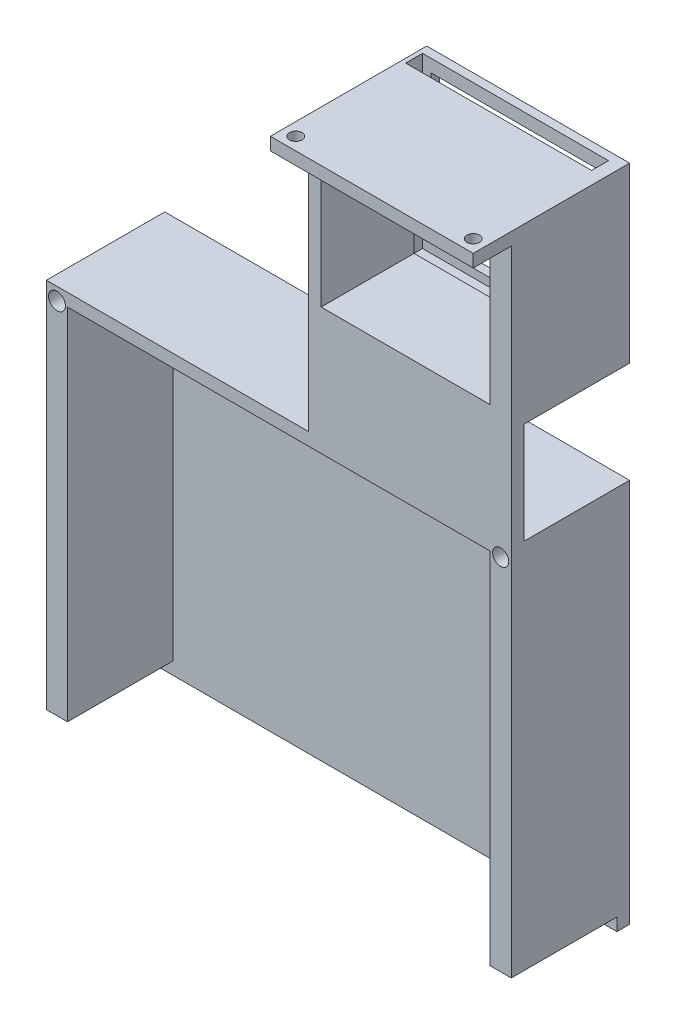
ISO-10303-21;
HEADER;
FILE_DESCRIPTION(('STEP AP214'),'2;1');
FILE_NAME('part.step','',(''),(''),'','','');
FILE_SCHEMA(('AUTOMOTIVE_DESIGN { 1 0 10303 214 1 1 1 1 }'));
ENDSEC;
DATA;
#1=APPLICATION_CONTEXT('core data for automotive mechanical design processes');
#2=APPLICATION_PROTOCOL_DEFINITION('international standard','automotive_design',2000,#1);
#3=PRODUCT_CONTEXT('',#1,'mechanical');
#4=PRODUCT('Part','Part','',(#3));
#5=PRODUCT_RELATED_PRODUCT_CATEGORY('part','',(#4));
#6=PRODUCT_DEFINITION_FORMATION('','',#4);
#7=PRODUCT_DEFINITION_CONTEXT('part definition',#1,'design');
#8=PRODUCT_DEFINITION('design','',#6,#7);
#9=PRODUCT_DEFINITION_SHAPE('','',#8);
#10=(LENGTH_UNIT() NAMED_UNIT(*) SI_UNIT(.MILLI.,.METRE.));
#11=(NAMED_UNIT(*) PLANE_ANGLE_UNIT() SI_UNIT($,.RADIAN.));
#12=(NAMED_UNIT(*) SI_UNIT($,.STERADIAN.) SOLID_ANGLE_UNIT());
#13=UNCERTAINTY_MEASURE_WITH_UNIT(LENGTH_MEASURE(1.E-05),#10,'distance_accuracy_value','');
#14=(GEOMETRIC_REPRESENTATION_CONTEXT(3) GLOBAL_UNCERTAINTY_ASSIGNED_CONTEXT((#13)) GLOBAL_UNIT_ASSIGNED_CONTEXT((#10,
#11,#12)) REPRESENTATION_CONTEXT('',''));
#15=CARTESIAN_POINT('',(0.,0.,0.));
#16=DIRECTION('',(0.,0.,1.));
#17=DIRECTION('',(1.,0.,0.));
#18=AXIS2_PLACEMENT_3D('',#15,#16,#17);
#19=CARTESIAN_POINT('',(0.,-3.,25.));
#20=DIRECTION('',(0.,-1.,0.));
#21=DIRECTION('',(0.,0.,-1.));
#22=AXIS2_PLACEMENT_3D('',#19,#20,#21);
#23=PLANE('',#22);
#24=DIRECTION('',(-1.,0.,0.));
#25=VECTOR('',#24,1.);
#26=CARTESIAN_POINT('',(0.,-3.,-3.));
#27=LINE('',#26,#25);
#28=CARTESIAN_POINT('',(45.,-3.,-3.));
#29=VERTEX_POINT('',#28);
#30=CARTESIAN_POINT('',(-65.,-3.,-3.));
#31=VERTEX_POINT('',#30);
#32=EDGE_CURVE('E481',#29,#31,#27,.T.);
#33=ORIENTED_EDGE('',*,*,#32,.F.);
#34=DIRECTION('',(0.,0.,-1.));
#35=VECTOR('',#34,1.);
#36=CARTESIAN_POINT('',(45.,-3.,-3.));
#37=LINE('',#36,#35);
#38=CARTESIAN_POINT('',(45.,-3.,0.));
#39=VERTEX_POINT('',#38);
#40=EDGE_CURVE('E312',#39,#29,#37,.T.);
#41=ORIENTED_EDGE('',*,*,#40,.F.);
#42=DIRECTION('',(1.,0.,0.));
#43=VECTOR('',#42,1.);
#44=CARTESIAN_POINT('',(45.,-3.,0.));
#45=LINE('',#44,#43);
#46=CARTESIAN_POINT('',(-65.,-3.,0.));
#47=VERTEX_POINT('',#46);
#48=EDGE_CURVE('E356',#47,#39,#45,.T.);
#49=ORIENTED_EDGE('',*,*,#48,.F.);
#50=DIRECTION('',(0.,0.,1.));
#51=VECTOR('',#50,1.);
#52=CARTESIAN_POINT('',(-65.,-3.,-3.));
#53=LINE('',#52,#51);
#54=EDGE_CURVE('E341',#31,#47,#53,.T.);
#55=ORIENTED_EDGE('',*,*,#54,.F.);
#56=EDGE_LOOP('',(#33,#41,#49,#55));
#57=FACE_BOUND('',#56,.T.);
#58=ADVANCED_FACE('F86',(#57),#23,.T.);
#59=CARTESIAN_POINT('',(0.,0.,25.));
#60=DIRECTION('',(0.,0.,-1.));
#61=DIRECTION('',(-1.,0.,0.));
#62=AXIS2_PLACEMENT_3D('',#59,#60,#61);
#63=PLANE('',#62);
#64=CARTESIAN_POINT('',(-62.5,85.,25.));
#65=DIRECTION('',(0.,0.,1.));
#66=DIRECTION('',(1.,0.,0.));
#67=AXIS2_PLACEMENT_3D('',#64,#65,#66);
#68=CIRCLE('',#67,2.);
#69=CARTESIAN_POINT('',(-60.5,85.,25.));
#70=VERTEX_POINT('',#69);
#71=EDGE_CURVE('E513',#70,#70,#68,.T.);
#72=ORIENTED_EDGE('',*,*,#71,.F.);
#73=EDGE_LOOP('',(#72));
#74=FACE_BOUND('',#73,.T.);
#75=CARTESIAN_POINT('',(42.5,85.,25.));
#76=DIRECTION('',(0.,0.,1.));
#77=DIRECTION('',(1.,0.,0.));
#78=AXIS2_PLACEMENT_3D('',#75,#76,#77);
#79=CIRCLE('',#78,1.91040313687551);
#80=CARTESIAN_POINT('',(44.4104031368755,85.,25.));
#81=VERTEX_POINT('',#80);
#82=EDGE_CURVE('E523',#81,#81,#79,.T.);
#83=ORIENTED_EDGE('',*,*,#82,.F.);
#84=EDGE_LOOP('',(#83));
#85=FACE_BOUND('',#84,.T.);
#86=DIRECTION('',(-1.,0.,0.));
#87=VECTOR('',#86,1.);
#88=CARTESIAN_POINT('',(-63.,88.,25.));
#89=LINE('',#88,#87);
#90=CARTESIAN_POINT('',(-3.,88.,25.));
#91=VERTEX_POINT('',#90);
#92=CARTESIAN_POINT('',(-65.,88.,25.));
#93=VERTEX_POINT('',#92);
#94=EDGE_CURVE('E373',#91,#93,#89,.T.);
#95=ORIENTED_EDGE('',*,*,#94,.T.);
#96=DIRECTION('',(0.,1.,0.));
#97=VECTOR('',#96,1.);
#98=CARTESIAN_POINT('',(-65.,0.,25.));
#99=LINE('',#98,#97);
#100=CARTESIAN_POINT('',(-65.,0.,25.));
#101=VERTEX_POINT('',#100);
#102=EDGE_CURVE('E340',#101,#93,#99,.T.);
#103=ORIENTED_EDGE('',*,*,#102,.F.);
#104=DIRECTION('',(1.,0.,0.));
#105=VECTOR('',#104,1.);
#106=CARTESIAN_POINT('',(0.,0.,25.));
#107=LINE('',#106,#105);
#108=CARTESIAN_POINT('',(-60.,0.,25.));
#109=VERTEX_POINT('',#108);
#110=EDGE_CURVE('E288',#101,#109,#107,.T.);
#111=ORIENTED_EDGE('',*,*,#110,.T.);
#112=DIRECTION('',(0.,-1.,0.));
#113=VECTOR('',#112,1.);
#114=CARTESIAN_POINT('',(-60.,85.,25.));
#115=LINE('',#114,#113);
#116=CARTESIAN_POINT('',(-60.,85.,25.));
#117=VERTEX_POINT('',#116);
#118=EDGE_CURVE('E370',#117,#109,#115,.T.);
#119=ORIENTED_EDGE('',*,*,#118,.F.);
#120=DIRECTION('',(1.,0.,0.));
#121=VECTOR('',#120,1.);
#122=CARTESIAN_POINT('',(0.,85.,25.));
#123=LINE('',#122,#121);
#124=CARTESIAN_POINT('',(40.,85.,25.));
#125=VERTEX_POINT('',#124);
#126=EDGE_CURVE('E443',#117,#125,#123,.T.);
#127=ORIENTED_EDGE('',*,*,#126,.T.);
#128=DIRECTION('',(0.,-1.,0.));
#129=VECTOR('',#128,1.);
#130=CARTESIAN_POINT('',(40.,0.,25.));
#131=LINE('',#130,#129);
#132=CARTESIAN_POINT('',(40.,0.,25.));
#133=VERTEX_POINT('',#132);
#134=EDGE_CURVE('E285',#125,#133,#131,.T.);
#135=ORIENTED_EDGE('',*,*,#134,.T.);
#136=CARTESIAN_POINT('',(45.,0.,25.));
#137=VERTEX_POINT('',#136);
#138=EDGE_CURVE('E278',#133,#137,#107,.T.);
#139=ORIENTED_EDGE('',*,*,#138,.T.);
#140=DIRECTION('',(0.,-1.,0.));
#141=VECTOR('',#140,1.);
#142=CARTESIAN_POINT('',(45.,0.,25.));
#143=LINE('',#142,#141);
#144=CARTESIAN_POINT('',(45.,150.,25.));
#145=VERTEX_POINT('',#144);
#146=EDGE_CURVE('E282',#145,#137,#143,.T.);
#147=ORIENTED_EDGE('',*,*,#146,.F.);
#148=DIRECTION('',(1.,0.,0.));
#149=VECTOR('',#148,1.);
#150=CARTESIAN_POINT('',(43.,150.,25.));
#151=LINE('',#150,#149);
#152=CARTESIAN_POINT('',(40.,150.,25.));
#153=VERTEX_POINT('',#152);
#154=EDGE_CURVE('E12',#153,#145,#151,.T.);
#155=ORIENTED_EDGE('',*,*,#154,.F.);
#156=CARTESIAN_POINT('',(40.,115.,25.));
#157=VERTEX_POINT('',#156);
#158=EDGE_CURVE('E472',#153,#157,#131,.T.);
#159=ORIENTED_EDGE('',*,*,#158,.T.);
#160=DIRECTION('',(-1.,0.,0.));
#161=VECTOR('',#160,1.);
#162=CARTESIAN_POINT('',(0.,115.,25.));
#163=LINE('',#162,#161);
#164=CARTESIAN_POINT('',(0.,115.,25.));
#165=VERTEX_POINT('',#164);
#166=EDGE_CURVE('E449',#157,#165,#163,.T.);
#167=ORIENTED_EDGE('',*,*,#166,.T.);
#168=DIRECTION('',(0.,1.,0.));
#169=VECTOR('',#168,1.);
#170=CARTESIAN_POINT('',(0.,0.,25.));
#171=LINE('',#170,#169);
#172=CARTESIAN_POINT('',(0.,150.,25.));
#173=VERTEX_POINT('',#172);
#174=EDGE_CURVE('E475',#165,#173,#171,.T.);
#175=ORIENTED_EDGE('',*,*,#174,.T.);
#176=CARTESIAN_POINT('',(-3.,150.,25.));
#177=VERTEX_POINT('',#176);
#178=EDGE_CURVE('E97',#177,#173,#151,.T.);
#179=ORIENTED_EDGE('',*,*,#178,.F.);
#180=DIRECTION('',(0.,1.,0.));
#181=VECTOR('',#180,1.);
#182=CARTESIAN_POINT('',(-3.,0.,25.));
#183=LINE('',#182,#181);
#184=EDGE_CURVE('E488',#91,#177,#183,.T.);
#185=ORIENTED_EDGE('',*,*,#184,.F.);
#186=EDGE_LOOP('',(#95,#103,#111,#119,#127,#135,#139,#147,#155,#159,#167,#175,#179,#185));
#187=FACE_BOUND('',#186,.T.);
#188=ADVANCED_FACE('F280',(#74,#85,#187),#63,.F.);
#189=CARTESIAN_POINT('',(-3.,0.,25.));
#190=DIRECTION('',(-1.,0.,0.));
#191=DIRECTION('',(0.,0.,1.));
#192=AXIS2_PLACEMENT_3D('',#189,#190,#191);
#193=PLANE('',#192);
#194=DIRECTION('',(0.,0.,-1.));
#195=VECTOR('',#194,1.);
#196=CARTESIAN_POINT('',(-3.,88.,25.));
#197=LINE('',#196,#195);
#198=CARTESIAN_POINT('',(-3.,88.,22.));
#199=VERTEX_POINT('',#198);
#200=EDGE_CURVE('E110',#91,#199,#197,.T.);
#201=ORIENTED_EDGE('',*,*,#200,.F.);
#202=ORIENTED_EDGE('',*,*,#184,.T.);
#203=DIRECTION('',(0.,0.,-1.));
#204=VECTOR('',#203,1.);
#205=CARTESIAN_POINT('',(-3.00000000000001,150.,80.0977222864644));
#206=LINE('',#205,#204);
#207=CARTESIAN_POINT('',(-3.00000000000001,150.,34.));
#208=VERTEX_POINT('',#207);
#209=EDGE_CURVE('E365',#208,#177,#206,.T.);
#210=ORIENTED_EDGE('',*,*,#209,.F.);
#211=DIRECTION('',(0.,1.,0.));
#212=VECTOR('',#211,1.);
#213=CARTESIAN_POINT('',(-3.00000000000001,153.,34.));
#214=LINE('',#213,#212);
#215=CARTESIAN_POINT('',(-3.00000000000001,153.,34.));
#216=VERTEX_POINT('',#215);
#217=EDGE_CURVE('E358',#208,#216,#214,.T.);
#218=ORIENTED_EDGE('',*,*,#217,.T.);
#219=DIRECTION('',(0.,0.,-1.));
#220=VECTOR('',#219,1.);
#221=CARTESIAN_POINT('',(-3.,153.,25.));
#222=LINE('',#221,#220);
#223=CARTESIAN_POINT('',(-3.,153.,-3.));
#224=VERTEX_POINT('',#223);
#225=EDGE_CURVE('E490',#216,#224,#222,.T.);
#226=ORIENTED_EDGE('',*,*,#225,.T.);
#227=DIRECTION('',(0.,1.,0.));
#228=VECTOR('',#227,1.);
#229=CARTESIAN_POINT('',(-3.,0.,-3.));
#230=LINE('',#229,#228);
#231=CARTESIAN_POINT('',(-3.,112.,-3.));
#232=VERTEX_POINT('',#231);
#233=EDGE_CURVE('E493',#232,#224,#230,.T.);
#234=ORIENTED_EDGE('',*,*,#233,.F.);
#235=DIRECTION('',(0.,0.,-1.));
#236=VECTOR('',#235,1.);
#237=CARTESIAN_POINT('',(-3.,112.,25.));
#238=LINE('',#237,#236);
#239=CARTESIAN_POINT('',(-3.,112.,22.));
#240=VERTEX_POINT('',#239);
#241=EDGE_CURVE('E465',#240,#232,#238,.T.);
#242=ORIENTED_EDGE('',*,*,#241,.F.);
#243=DIRECTION('',(0.,1.,0.));
#244=VECTOR('',#243,1.);
#245=CARTESIAN_POINT('',(-3.,0.,22.));
#246=LINE('',#245,#244);
#247=EDGE_CURVE('E470',#199,#240,#246,.T.);
#248=ORIENTED_EDGE('',*,*,#247,.F.);
#249=EDGE_LOOP('',(#201,#202,#210,#218,#226,#234,#242,#248));
#250=FACE_BOUND('',#249,.T.);
#251=ADVANCED_FACE('F595',(#250),#193,.T.);
#252=CARTESIAN_POINT('',(40.,0.,25.));
#253=DIRECTION('',(1.,0.,0.));
#254=DIRECTION('',(0.,0.,-1.));
#255=AXIS2_PLACEMENT_3D('',#252,#253,#254);
#256=PLANE('',#255);
#257=DIRECTION('',(0.,1.,0.));
#258=VECTOR('',#257,1.);
#259=CARTESIAN_POINT('',(40.,0.,3.00000000000001));
#260=LINE('',#259,#258);
#261=CARTESIAN_POINT('',(40.,115.,3.00000000000001));
#262=VERTEX_POINT('',#261);
#263=CARTESIAN_POINT('',(40.,150.,3.00000000000001));
#264=VERTEX_POINT('',#263);
#265=EDGE_CURVE('E417',#262,#264,#260,.T.);
#266=ORIENTED_EDGE('',*,*,#265,.F.);
#267=DIRECTION('',(0.,0.,-1.));
#268=VECTOR('',#267,1.);
#269=CARTESIAN_POINT('',(40.,115.,25.));
#270=LINE('',#269,#268);
#271=EDGE_CURVE('E456',#157,#262,#270,.T.);
#272=ORIENTED_EDGE('',*,*,#271,.F.);
#273=ORIENTED_EDGE('',*,*,#158,.F.);
#274=DIRECTION('',(0.,0.,-1.));
#275=VECTOR('',#274,1.);
#276=CARTESIAN_POINT('',(40.,150.,25.));
#277=LINE('',#276,#275);
#278=EDGE_CURVE('E478',#153,#264,#277,.T.);
#279=ORIENTED_EDGE('',*,*,#278,.T.);
#280=EDGE_LOOP('',(#266,#272,#273,#279));
#281=FACE_BOUND('',#280,.T.);
#282=ADVANCED_FACE('F618',(#281),#256,.F.);
#283=CARTESIAN_POINT('',(0.,0.,25.));
#284=DIRECTION('',(-1.,0.,0.));
#285=DIRECTION('',(0.,0.,1.));
#286=AXIS2_PLACEMENT_3D('',#283,#284,#285);
#287=PLANE('',#286);
#288=DIRECTION('',(0.,-1.,0.));
#289=VECTOR('',#288,1.);
#290=CARTESIAN_POINT('',(0.,0.,3.00000000000001));
#291=LINE('',#290,#289);
#292=CARTESIAN_POINT('',(0.,150.,3.00000000000001));
#293=VERTEX_POINT('',#292);
#294=CARTESIAN_POINT('',(0.,115.,3.00000000000001));
#295=VERTEX_POINT('',#294);
#296=EDGE_CURVE('E409',#293,#295,#291,.T.);
#297=ORIENTED_EDGE('',*,*,#296,.F.);
#298=DIRECTION('',(0.,0.,-1.));
#299=VECTOR('',#298,1.);
#300=CARTESIAN_POINT('',(0.,150.,25.));
#301=LINE('',#300,#299);
#302=EDGE_CURVE('E483',#173,#293,#301,.T.);
#303=ORIENTED_EDGE('',*,*,#302,.F.);
#304=ORIENTED_EDGE('',*,*,#174,.F.);
#305=DIRECTION('',(0.,0.,-1.));
#306=VECTOR('',#305,1.);
#307=CARTESIAN_POINT('',(0.,115.,25.));
#308=LINE('',#307,#306);
#309=EDGE_CURVE('E452',#165,#295,#308,.T.);
#310=ORIENTED_EDGE('',*,*,#309,.T.);
#311=EDGE_LOOP('',(#297,#303,#304,#310));
#312=FACE_BOUND('',#311,.T.);
#313=ADVANCED_FACE('F626',(#312),#287,.F.);
#314=CARTESIAN_POINT('',(0.,153.,25.));
#315=DIRECTION('',(0.,1.,0.));
#316=DIRECTION('',(0.,0.,1.));
#317=AXIS2_PLACEMENT_3D('',#314,#315,#316);
#318=PLANE('',#317);
#319=CARTESIAN_POINT('',(42.,153.,31.));
#320=DIRECTION('',(0.,1.,0.));
#321=DIRECTION('',(0.,0.,1.));
#322=AXIS2_PLACEMENT_3D('',#319,#320,#321);
#323=CIRCLE('',#322,1.5);
#324=CARTESIAN_POINT('',(42.,153.,32.5));
#325=VERTEX_POINT('',#324);
#326=EDGE_CURVE('E526',#325,#325,#323,.T.);
#327=ORIENTED_EDGE('',*,*,#326,.F.);
#328=EDGE_LOOP('',(#327));
#329=FACE_BOUND('',#328,.T.);
#330=CARTESIAN_POINT('',(0.,153.,31.));
#331=DIRECTION('',(0.,1.,0.));
#332=DIRECTION('',(0.,0.,1.));
#333=AXIS2_PLACEMENT_3D('',#330,#331,#332);
#334=CIRCLE('',#333,1.5);
#335=CARTESIAN_POINT('',(0.,153.,32.5));
#336=VERTEX_POINT('',#335);
#337=EDGE_CURVE('E506',#336,#336,#334,.T.);
#338=ORIENTED_EDGE('',*,*,#337,.F.);
#339=EDGE_LOOP('',(#338));
#340=FACE_BOUND('',#339,.T.);
#341=DIRECTION('',(1.,0.,0.));
#342=VECTOR('',#341,1.);
#343=CARTESIAN_POINT('',(0.,153.,-3.));
#344=LINE('',#343,#342);
#345=CARTESIAN_POINT('',(45.,153.,-3.));
#346=VERTEX_POINT('',#345);
#347=EDGE_CURVE('E491',#224,#346,#344,.T.);
#348=ORIENTED_EDGE('',*,*,#347,.F.);
#349=ORIENTED_EDGE('',*,*,#225,.F.);
#350=DIRECTION('',(1.,0.,0.));
#351=VECTOR('',#350,1.);
#352=CARTESIAN_POINT('',(43.,153.,34.));
#353=LINE('',#352,#351);
#354=CARTESIAN_POINT('',(45.,153.,34.));
#355=VERTEX_POINT('',#354);
#356=EDGE_CURVE('E361',#216,#355,#353,.T.);
#357=ORIENTED_EDGE('',*,*,#356,.T.);
#358=DIRECTION('',(0.,0.,1.));
#359=VECTOR('',#358,1.);
#360=CARTESIAN_POINT('',(45.,153.,-3.));
#361=LINE('',#360,#359);
#362=EDGE_CURVE('E330',#346,#355,#361,.T.);
#363=ORIENTED_EDGE('',*,*,#362,.F.);
#364=EDGE_LOOP('',(#348,#349,#357,#363));
#365=FACE_BOUND('',#364,.T.);
#366=DIRECTION('',(-1.,0.,0.));
#367=VECTOR('',#366,1.);
#368=CARTESIAN_POINT('',(0.,153.,3.00000000000001));
#369=LINE('',#368,#367);
#370=CARTESIAN_POINT('',(42.,153.,3.00000000000001));
#371=VERTEX_POINT('',#370);
#372=CARTESIAN_POINT('',(-2.,153.,3.00000000000001));
#373=VERTEX_POINT('',#372);
#374=EDGE_CURVE('E399',#371,#373,#369,.T.);
#375=ORIENTED_EDGE('',*,*,#374,.T.);
#376=DIRECTION('',(0.,0.,-1.));
#377=VECTOR('',#376,1.);
#378=CARTESIAN_POINT('',(-2.,153.,0.));
#379=LINE('',#378,#377);
#380=CARTESIAN_POINT('',(-2.,153.,-0.999999999999995));
#381=VERTEX_POINT('',#380);
#382=EDGE_CURVE('E384',#373,#381,#379,.T.);
#383=ORIENTED_EDGE('',*,*,#382,.T.);
#384=DIRECTION('',(-1.,0.,0.));
#385=VECTOR('',#384,1.);
#386=CARTESIAN_POINT('',(0.,153.,-0.999999999999995));
#387=LINE('',#386,#385);
#388=CARTESIAN_POINT('',(42.,153.,-0.999999999999995));
#389=VERTEX_POINT('',#388);
#390=EDGE_CURVE('E388',#389,#381,#387,.T.);
#391=ORIENTED_EDGE('',*,*,#390,.F.);
#392=DIRECTION('',(0.,0.,-1.));
#393=VECTOR('',#392,1.);
#394=CARTESIAN_POINT('',(42.,153.,0.));
#395=LINE('',#394,#393);
#396=EDGE_CURVE('E402',#371,#389,#395,.T.);
#397=ORIENTED_EDGE('',*,*,#396,.F.);
#398=EDGE_LOOP('',(#375,#383,#391,#397));
#399=FACE_BOUND('',#398,.T.);
#400=ADVANCED_FACE('F603',(#329,#340,#365,#399),#318,.T.);
#401=CARTESIAN_POINT('',(40.,150.,25.));
#402=DIRECTION('',(0.,1.,0.));
#403=DIRECTION('',(0.,0.,1.));
#404=AXIS2_PLACEMENT_3D('',#401,#402,#403);
#405=PLANE('',#404);
#406=CARTESIAN_POINT('',(42.,150.,31.));
#407=DIRECTION('',(0.,1.,0.));
#408=DIRECTION('',(0.,0.,1.));
#409=AXIS2_PLACEMENT_3D('',#406,#407,#408);
#410=CIRCLE('',#409,1.5);
#411=CARTESIAN_POINT('',(42.,150.,32.5));
#412=VERTEX_POINT('',#411);
#413=EDGE_CURVE('E90',#412,#412,#410,.T.);
#414=ORIENTED_EDGE('',*,*,#413,.T.);
#415=EDGE_LOOP('',(#414));
#416=FACE_BOUND('',#415,.T.);
#417=CARTESIAN_POINT('',(0.,150.,31.));
#418=DIRECTION('',(0.,1.,0.));
#419=DIRECTION('',(0.,0.,1.));
#420=AXIS2_PLACEMENT_3D('',#417,#418,#419);
#421=CIRCLE('',#420,1.5);
#422=CARTESIAN_POINT('',(0.,150.,32.5));
#423=VERTEX_POINT('',#422);
#424=EDGE_CURVE('E504',#423,#423,#421,.T.);
#425=ORIENTED_EDGE('',*,*,#424,.T.);
#426=EDGE_LOOP('',(#425));
#427=FACE_BOUND('',#426,.T.);
#428=DIRECTION('',(-1.,0.,0.));
#429=VECTOR('',#428,1.);
#430=CARTESIAN_POINT('',(40.,150.,3.00000000000001));
#431=LINE('',#430,#429);
#432=EDGE_CURVE('E419',#264,#293,#431,.T.);
#433=ORIENTED_EDGE('',*,*,#432,.F.);
#434=ORIENTED_EDGE('',*,*,#278,.F.);
#435=ORIENTED_EDGE('',*,*,#154,.T.);
#436=DIRECTION('',(0.,0.,-1.));
#437=VECTOR('',#436,1.);
#438=CARTESIAN_POINT('',(45.,150.,25.));
#439=LINE('',#438,#437);
#440=CARTESIAN_POINT('',(45.,150.,34.));
#441=VERTEX_POINT('',#440);
#442=EDGE_CURVE('E303',#441,#145,#439,.T.);
#443=ORIENTED_EDGE('',*,*,#442,.F.);
#444=DIRECTION('',(-1.,0.,0.));
#445=VECTOR('',#444,1.);
#446=CARTESIAN_POINT('',(43.,150.,34.));
#447=LINE('',#446,#445);
#448=EDGE_CURVE('E362',#441,#208,#447,.T.);
#449=ORIENTED_EDGE('',*,*,#448,.T.);
#450=ORIENTED_EDGE('',*,*,#209,.T.);
#451=ORIENTED_EDGE('',*,*,#178,.T.);
#452=ORIENTED_EDGE('',*,*,#302,.T.);
#453=EDGE_LOOP('',(#433,#434,#435,#443,#449,#450,#451,#452));
#454=FACE_BOUND('',#453,.T.);
#455=ADVANCED_FACE('F611',(#416,#427,#454),#405,.F.);
#456=CARTESIAN_POINT('',(0.,115.,25.));
#457=DIRECTION('',(0.,-1.,0.));
#458=DIRECTION('',(0.,0.,-1.));
#459=AXIS2_PLACEMENT_3D('',#456,#457,#458);
#460=PLANE('',#459);
#461=DIRECTION('',(1.,0.,0.));
#462=VECTOR('',#461,1.);
#463=CARTESIAN_POINT('',(0.,115.,3.00000000000001));
#464=LINE('',#463,#462);
#465=EDGE_CURVE('E501',#295,#262,#464,.T.);
#466=ORIENTED_EDGE('',*,*,#465,.F.);
#467=ORIENTED_EDGE('',*,*,#309,.F.);
#468=ORIENTED_EDGE('',*,*,#166,.F.);
#469=ORIENTED_EDGE('',*,*,#271,.T.);
#470=EDGE_LOOP('',(#466,#467,#468,#469));
#471=FACE_BOUND('',#470,.T.);
#472=ADVANCED_FACE('F621',(#471),#460,.F.);
#473=DIRECTION('',(0.,0.,-1.));
#474=VECTOR('',#473,1.);
#475=CARTESIAN_POINT('',(40.,85.,25.));
#476=LINE('',#475,#474);
#477=CARTESIAN_POINT('',(40.,85.,0.));
#478=VERTEX_POINT('',#477);
#479=EDGE_CURVE('E445',#125,#478,#476,.T.);
#480=ORIENTED_EDGE('',*,*,#479,.T.);
#481=DIRECTION('',(0.,1.,0.));
#482=VECTOR('',#481,1.);
#483=CARTESIAN_POINT('',(40.,0.,0.));
#484=LINE('',#483,#482);
#485=CARTESIAN_POINT('',(40.,0.,0.));
#486=VERTEX_POINT('',#485);
#487=EDGE_CURVE('E498',#486,#478,#484,.T.);
#488=ORIENTED_EDGE('',*,*,#487,.F.);
#489=DIRECTION('',(0.,0.,-1.));
#490=VECTOR('',#489,1.);
#491=CARTESIAN_POINT('',(40.,0.,25.));
#492=LINE('',#491,#490);
#493=EDGE_CURVE('E477',#133,#486,#492,.T.);
#494=ORIENTED_EDGE('',*,*,#493,.F.);
#495=ORIENTED_EDGE('',*,*,#134,.F.);
#496=EDGE_LOOP('',(#480,#488,#494,#495));
#497=FACE_BOUND('',#496,.T.);
#498=ADVANCED_FACE('F576',(#497),#256,.F.);
#499=CARTESIAN_POINT('',(0.,0.,0.));
#500=DIRECTION('',(0.,0.,1.));
#501=DIRECTION('',(1.,0.,0.));
#502=AXIS2_PLACEMENT_3D('',#499,#500,#501);
#503=PLANE('',#502);
#504=ORIENTED_EDGE('',*,*,#487,.T.);
#505=DIRECTION('',(1.,0.,0.));
#506=VECTOR('',#505,1.);
#507=CARTESIAN_POINT('',(0.,85.,0.));
#508=LINE('',#507,#506);
#509=CARTESIAN_POINT('',(-60.,85.,0.));
#510=VERTEX_POINT('',#509);
#511=EDGE_CURVE('E442',#510,#478,#508,.T.);
#512=ORIENTED_EDGE('',*,*,#511,.F.);
#513=DIRECTION('',(0.,1.,0.));
#514=VECTOR('',#513,1.);
#515=CARTESIAN_POINT('',(-60.,0.,0.));
#516=LINE('',#515,#514);
#517=CARTESIAN_POINT('',(-60.,0.,0.));
#518=VERTEX_POINT('',#517);
#519=EDGE_CURVE('E381',#518,#510,#516,.T.);
#520=ORIENTED_EDGE('',*,*,#519,.F.);
#521=DIRECTION('',(-1.,0.,0.));
#522=VECTOR('',#521,1.);
#523=CARTESIAN_POINT('',(45.,0.,0.));
#524=LINE('',#523,#522);
#525=CARTESIAN_POINT('',(-65.,0.,0.));
#526=VERTEX_POINT('',#525);
#527=EDGE_CURVE('E350',#518,#526,#524,.T.);
#528=ORIENTED_EDGE('',*,*,#527,.T.);
#529=DIRECTION('',(0.,-1.,0.));
#530=VECTOR('',#529,1.);
#531=CARTESIAN_POINT('',(-65.,0.,0.));
#532=LINE('',#531,#530);
#533=EDGE_CURVE('E336',#526,#47,#532,.T.);
#534=ORIENTED_EDGE('',*,*,#533,.T.);
#535=ORIENTED_EDGE('',*,*,#48,.T.);
#536=DIRECTION('',(0.,-1.,0.));
#537=VECTOR('',#536,1.);
#538=CARTESIAN_POINT('',(45.,-3.,0.));
#539=LINE('',#538,#537);
#540=CARTESIAN_POINT('',(45.,0.,0.));
#541=VERTEX_POINT('',#540);
#542=EDGE_CURVE('E298',#541,#39,#539,.T.);
#543=ORIENTED_EDGE('',*,*,#542,.F.);
#544=EDGE_CURVE('E294',#541,#486,#524,.T.);
#545=ORIENTED_EDGE('',*,*,#544,.T.);
#546=EDGE_LOOP('',(#504,#512,#520,#528,#534,#535,#543,#545));
#547=FACE_BOUND('',#546,.T.);
#548=ADVANCED_FACE('F88',(#547),#503,.T.);
#549=CARTESIAN_POINT('',(40.,115.,-0.999999999999994));
#550=VERTEX_POINT('',#549);
#551=CARTESIAN_POINT('',(40.,115.,-3.));
#552=VERTEX_POINT('',#551);
#553=EDGE_CURVE('E455',#550,#552,#270,.T.);
#554=ORIENTED_EDGE('',*,*,#553,.F.);
#555=DIRECTION('',(0.,1.,0.));
#556=VECTOR('',#555,1.);
#557=CARTESIAN_POINT('',(40.,0.,-0.999999999999994));
#558=LINE('',#557,#556);
#559=CARTESIAN_POINT('',(40.,150.,-0.999999999999994));
#560=VERTEX_POINT('',#559);
#561=EDGE_CURVE('E424',#550,#560,#558,.T.);
#562=ORIENTED_EDGE('',*,*,#561,.T.);
#563=CARTESIAN_POINT('',(40.,150.,-3.));
#564=VERTEX_POINT('',#563);
#565=EDGE_CURVE('E482',#560,#564,#277,.T.);
#566=ORIENTED_EDGE('',*,*,#565,.T.);
#567=DIRECTION('',(0.,1.,0.));
#568=VECTOR('',#567,1.);
#569=CARTESIAN_POINT('',(40.,115.,-3.));
#570=LINE('',#569,#568);
#571=EDGE_CURVE('E436',#552,#564,#570,.T.);
#572=ORIENTED_EDGE('',*,*,#571,.F.);
#573=EDGE_LOOP('',(#554,#562,#566,#572));
#574=FACE_BOUND('',#573,.T.);
#575=ADVANCED_FACE('F676',(#574),#256,.F.);
#576=CARTESIAN_POINT('',(0.,150.,-0.999999999999994));
#577=VERTEX_POINT('',#576);
#578=CARTESIAN_POINT('',(0.,150.,-3.));
#579=VERTEX_POINT('',#578);
#580=EDGE_CURVE('E486',#577,#579,#301,.T.);
#581=ORIENTED_EDGE('',*,*,#580,.F.);
#582=DIRECTION('',(0.,-1.,0.));
#583=VECTOR('',#582,1.);
#584=CARTESIAN_POINT('',(0.,0.,-0.999999999999994));
#585=LINE('',#584,#583);
#586=CARTESIAN_POINT('',(0.,115.,-0.999999999999994));
#587=VERTEX_POINT('',#586);
#588=EDGE_CURVE('E421',#577,#587,#585,.T.);
#589=ORIENTED_EDGE('',*,*,#588,.T.);
#590=CARTESIAN_POINT('',(0.,115.,-3.));
#591=VERTEX_POINT('',#590);
#592=EDGE_CURVE('E451',#587,#591,#308,.T.);
#593=ORIENTED_EDGE('',*,*,#592,.T.);
#594=DIRECTION('',(0.,-1.,0.));
#595=VECTOR('',#594,1.);
#596=CARTESIAN_POINT('',(0.,115.,-3.));
#597=LINE('',#596,#595);
#598=EDGE_CURVE('E430',#579,#591,#597,.T.);
#599=ORIENTED_EDGE('',*,*,#598,.F.);
#600=EDGE_LOOP('',(#581,#589,#593,#599));
#601=FACE_BOUND('',#600,.T.);
#602=ADVANCED_FACE('F663',(#601),#287,.F.);
#603=CARTESIAN_POINT('',(0.,0.,-3.));
#604=DIRECTION('',(0.,0.,1.));
#605=DIRECTION('',(1.,0.,0.));
#606=AXIS2_PLACEMENT_3D('',#603,#604,#605);
#607=PLANE('',#606);
#608=ORIENTED_EDGE('',*,*,#32,.T.);
#609=DIRECTION('',(0.,-1.,0.));
#610=VECTOR('',#609,1.);
#611=CARTESIAN_POINT('',(-65.,0.,-3.));
#612=LINE('',#611,#610);
#613=CARTESIAN_POINT('',(-65.,88.,-3.));
#614=VERTEX_POINT('',#613);
#615=EDGE_CURVE('E347',#614,#31,#612,.T.);
#616=ORIENTED_EDGE('',*,*,#615,.F.);
#617=DIRECTION('',(-1.,0.,0.));
#618=VECTOR('',#617,1.);
#619=CARTESIAN_POINT('',(0.,88.,-3.));
#620=LINE('',#619,#618);
#621=CARTESIAN_POINT('',(45.,88.,-3.));
#622=VERTEX_POINT('',#621);
#623=EDGE_CURVE('E463',#622,#614,#620,.T.);
#624=ORIENTED_EDGE('',*,*,#623,.F.);
#625=DIRECTION('',(0.,1.,0.));
#626=VECTOR('',#625,1.);
#627=CARTESIAN_POINT('',(45.,-3.,-3.));
#628=LINE('',#627,#626);
#629=EDGE_CURVE('E315',#29,#622,#628,.T.);
#630=ORIENTED_EDGE('',*,*,#629,.F.);
#631=EDGE_LOOP('',(#608,#616,#624,#630));
#632=FACE_BOUND('',#631,.T.);
#633=ADVANCED_FACE('F582',(#632),#607,.F.);
#634=DIRECTION('',(-1.,0.,0.));
#635=VECTOR('',#634,1.);
#636=CARTESIAN_POINT('',(0.,150.,-3.));
#637=LINE('',#636,#635);
#638=EDGE_CURVE('E439',#564,#579,#637,.T.);
#639=ORIENTED_EDGE('',*,*,#638,.T.);
#640=ORIENTED_EDGE('',*,*,#598,.T.);
#641=DIRECTION('',(1.,0.,0.));
#642=VECTOR('',#641,1.);
#643=CARTESIAN_POINT('',(0.,115.,-3.));
#644=LINE('',#643,#642);
#645=EDGE_CURVE('E433',#591,#552,#644,.T.);
#646=ORIENTED_EDGE('',*,*,#645,.T.);
#647=ORIENTED_EDGE('',*,*,#571,.T.);
#648=EDGE_LOOP('',(#639,#640,#646,#647));
#649=FACE_BOUND('',#648,.T.);
#650=ORIENTED_EDGE('',*,*,#347,.T.);
#651=DIRECTION('',(0.,1.,0.));
#652=VECTOR('',#651,1.);
#653=CARTESIAN_POINT('',(45.,112.,-3.));
#654=LINE('',#653,#652);
#655=CARTESIAN_POINT('',(45.,112.,-3.));
#656=VERTEX_POINT('',#655);
#657=EDGE_CURVE('E327',#656,#346,#654,.T.);
#658=ORIENTED_EDGE('',*,*,#657,.F.);
#659=DIRECTION('',(-1.,0.,0.));
#660=VECTOR('',#659,1.);
#661=CARTESIAN_POINT('',(0.,112.,-3.));
#662=LINE('',#661,#660);
#663=EDGE_CURVE('E467',#656,#232,#662,.T.);
#664=ORIENTED_EDGE('',*,*,#663,.T.);
#665=ORIENTED_EDGE('',*,*,#233,.T.);
#666=EDGE_LOOP('',(#650,#658,#664,#665));
#667=FACE_BOUND('',#666,.T.);
#668=ADVANCED_FACE('F598',(#649,#667),#607,.F.);
#669=ORIENTED_EDGE('',*,*,#565,.F.);
#670=DIRECTION('',(-1.,0.,0.));
#671=VECTOR('',#670,1.);
#672=CARTESIAN_POINT('',(40.,150.,-0.999999999999994));
#673=LINE('',#672,#671);
#674=EDGE_CURVE('E427',#560,#577,#673,.T.);
#675=ORIENTED_EDGE('',*,*,#674,.T.);
#676=ORIENTED_EDGE('',*,*,#580,.T.);
#677=ORIENTED_EDGE('',*,*,#638,.F.);
#678=EDGE_LOOP('',(#669,#675,#676,#677));
#679=FACE_BOUND('',#678,.T.);
#680=ADVANCED_FACE('F655',(#679),#405,.F.);
#681=CARTESIAN_POINT('',(0.,0.,22.));
#682=DIRECTION('',(0.,0.,1.));
#683=DIRECTION('',(1.,0.,0.));
#684=AXIS2_PLACEMENT_3D('',#681,#682,#683);
#685=PLANE('',#684);
#686=DIRECTION('',(1.,0.,0.));
#687=VECTOR('',#686,1.);
#688=CARTESIAN_POINT('',(0.,112.,22.));
#689=LINE('',#688,#687);
#690=CARTESIAN_POINT('',(45.,112.,22.));
#691=VERTEX_POINT('',#690);
#692=EDGE_CURVE('E459',#240,#691,#689,.T.);
#693=ORIENTED_EDGE('',*,*,#692,.T.);
#694=DIRECTION('',(0.,1.,0.));
#695=VECTOR('',#694,1.);
#696=CARTESIAN_POINT('',(45.,88.,22.));
#697=LINE('',#696,#695);
#698=CARTESIAN_POINT('',(45.,88.,22.));
#699=VERTEX_POINT('',#698);
#700=EDGE_CURVE('E321',#699,#691,#697,.T.);
#701=ORIENTED_EDGE('',*,*,#700,.F.);
#702=DIRECTION('',(1.,0.,0.));
#703=VECTOR('',#702,1.);
#704=CARTESIAN_POINT('',(0.,88.,22.));
#705=LINE('',#704,#703);
#706=EDGE_CURVE('E461',#199,#699,#705,.T.);
#707=ORIENTED_EDGE('',*,*,#706,.F.);
#708=ORIENTED_EDGE('',*,*,#247,.T.);
#709=EDGE_LOOP('',(#693,#701,#707,#708));
#710=FACE_BOUND('',#709,.T.);
#711=ADVANCED_FACE('F589',(#710),#685,.F.);
#712=CARTESIAN_POINT('',(0.,112.,22.));
#713=DIRECTION('',(0.,1.,0.));
#714=DIRECTION('',(0.,0.,1.));
#715=AXIS2_PLACEMENT_3D('',#712,#713,#714);
#716=PLANE('',#715);
#717=ORIENTED_EDGE('',*,*,#663,.F.);
#718=DIRECTION('',(0.,0.,-1.));
#719=VECTOR('',#718,1.);
#720=CARTESIAN_POINT('',(45.,112.,-3.));
#721=LINE('',#720,#719);
#722=EDGE_CURVE('E324',#691,#656,#721,.T.);
#723=ORIENTED_EDGE('',*,*,#722,.F.);
#724=ORIENTED_EDGE('',*,*,#692,.F.);
#725=ORIENTED_EDGE('',*,*,#241,.T.);
#726=EDGE_LOOP('',(#717,#723,#724,#725));
#727=FACE_BOUND('',#726,.T.);
#728=ADVANCED_FACE('F593',(#727),#716,.F.);
#729=CARTESIAN_POINT('',(0.,88.,22.));
#730=DIRECTION('',(0.,1.,0.));
#731=DIRECTION('',(0.,0.,1.));
#732=AXIS2_PLACEMENT_3D('',#729,#730,#731);
#733=PLANE('',#732);
#734=ORIENTED_EDGE('',*,*,#623,.T.);
#735=DIRECTION('',(0.,0.,-1.));
#736=VECTOR('',#735,1.);
#737=CARTESIAN_POINT('',(-65.,88.,0.));
#738=LINE('',#737,#736);
#739=EDGE_CURVE('E344',#93,#614,#738,.T.);
#740=ORIENTED_EDGE('',*,*,#739,.F.);
#741=ORIENTED_EDGE('',*,*,#94,.F.);
#742=ORIENTED_EDGE('',*,*,#200,.T.);
#743=ORIENTED_EDGE('',*,*,#706,.T.);
#744=DIRECTION('',(0.,0.,1.));
#745=VECTOR('',#744,1.);
#746=CARTESIAN_POINT('',(45.,88.,22.));
#747=LINE('',#746,#745);
#748=EDGE_CURVE('E318',#622,#699,#747,.T.);
#749=ORIENTED_EDGE('',*,*,#748,.F.);
#750=EDGE_LOOP('',(#734,#740,#741,#742,#743,#749));
#751=FACE_BOUND('',#750,.T.);
#752=ADVANCED_FACE('F584',(#751),#733,.T.);
#753=ORIENTED_EDGE('',*,*,#592,.F.);
#754=DIRECTION('',(1.,0.,0.));
#755=VECTOR('',#754,1.);
#756=CARTESIAN_POINT('',(0.,115.,-0.999999999999994));
#757=LINE('',#756,#755);
#758=EDGE_CURVE('E95',#587,#550,#757,.T.);
#759=ORIENTED_EDGE('',*,*,#758,.T.);
#760=ORIENTED_EDGE('',*,*,#553,.T.);
#761=ORIENTED_EDGE('',*,*,#645,.F.);
#762=EDGE_LOOP('',(#753,#759,#760,#761));
#763=FACE_BOUND('',#762,.T.);
#764=ADVANCED_FACE('F673',(#763),#460,.F.);
#765=CARTESIAN_POINT('',(0.,85.,25.));
#766=DIRECTION('',(0.,1.,0.));
#767=DIRECTION('',(0.,0.,1.));
#768=AXIS2_PLACEMENT_3D('',#765,#766,#767);
#769=PLANE('',#768);
#770=ORIENTED_EDGE('',*,*,#511,.T.);
#771=ORIENTED_EDGE('',*,*,#479,.F.);
#772=ORIENTED_EDGE('',*,*,#126,.F.);
#773=DIRECTION('',(0.,0.,-1.));
#774=VECTOR('',#773,1.);
#775=CARTESIAN_POINT('',(-60.,85.,135.679718105893));
#776=LINE('',#775,#774);
#777=EDGE_CURVE('E363',#117,#510,#776,.T.);
#778=ORIENTED_EDGE('',*,*,#777,.T.);
#779=EDGE_LOOP('',(#770,#771,#772,#778));
#780=FACE_BOUND('',#779,.T.);
#781=ADVANCED_FACE('F573',(#780),#769,.F.);
#782=CARTESIAN_POINT('',(0.,113.,-0.999999999999995));
#783=DIRECTION('',(0.,0.,-1.));
#784=DIRECTION('',(-1.,0.,0.));
#785=AXIS2_PLACEMENT_3D('',#782,#783,#784);
#786=PLANE('',#785);
#787=ORIENTED_EDGE('',*,*,#390,.T.);
#788=DIRECTION('',(0.,1.,0.));
#789=VECTOR('',#788,1.);
#790=CARTESIAN_POINT('',(-2.,113.,-0.999999999999995));
#791=LINE('',#790,#789);
#792=CARTESIAN_POINT('',(-2.,113.,-0.999999999999995));
#793=VERTEX_POINT('',#792);
#794=EDGE_CURVE('E407',#793,#381,#791,.T.);
#795=ORIENTED_EDGE('',*,*,#794,.F.);
#796=DIRECTION('',(-1.,0.,0.));
#797=VECTOR('',#796,1.);
#798=CARTESIAN_POINT('',(0.,113.,-0.999999999999995));
#799=LINE('',#798,#797);
#800=CARTESIAN_POINT('',(42.,113.,-0.999999999999995));
#801=VERTEX_POINT('',#800);
#802=EDGE_CURVE('E393',#801,#793,#799,.T.);
#803=ORIENTED_EDGE('',*,*,#802,.F.);
#804=DIRECTION('',(0.,1.,0.));
#805=VECTOR('',#804,1.);
#806=CARTESIAN_POINT('',(42.,113.,-0.999999999999995));
#807=LINE('',#806,#805);
#808=EDGE_CURVE('E410',#801,#389,#807,.T.);
#809=ORIENTED_EDGE('',*,*,#808,.T.);
#810=EDGE_LOOP('',(#787,#795,#803,#809));
#811=FACE_BOUND('',#810,.T.);
#812=ORIENTED_EDGE('',*,*,#561,.F.);
#813=ORIENTED_EDGE('',*,*,#758,.F.);
#814=ORIENTED_EDGE('',*,*,#588,.F.);
#815=ORIENTED_EDGE('',*,*,#674,.F.);
#816=EDGE_LOOP('',(#812,#813,#814,#815));
#817=FACE_BOUND('',#816,.T.);
#818=ADVANCED_FACE('F631',(#811,#817),#786,.F.);
#819=CARTESIAN_POINT('',(0.,113.,3.00000000000001));
#820=DIRECTION('',(0.,0.,-1.));
#821=DIRECTION('',(-1.,0.,0.));
#822=AXIS2_PLACEMENT_3D('',#819,#820,#821);
#823=PLANE('',#822);
#824=ORIENTED_EDGE('',*,*,#374,.F.);
#825=DIRECTION('',(0.,1.,0.));
#826=VECTOR('',#825,1.);
#827=CARTESIAN_POINT('',(42.,113.,3.00000000000001));
#828=LINE('',#827,#826);
#829=CARTESIAN_POINT('',(42.,113.,3.00000000000001));
#830=VERTEX_POINT('',#829);
#831=EDGE_CURVE('E412',#830,#371,#828,.T.);
#832=ORIENTED_EDGE('',*,*,#831,.F.);
#833=DIRECTION('',(-1.,0.,0.));
#834=VECTOR('',#833,1.);
#835=CARTESIAN_POINT('',(0.,113.,3.00000000000001));
#836=LINE('',#835,#834);
#837=CARTESIAN_POINT('',(-2.,113.,3.00000000000001));
#838=VERTEX_POINT('',#837);
#839=EDGE_CURVE('E387',#830,#838,#836,.T.);
#840=ORIENTED_EDGE('',*,*,#839,.T.);
#841=DIRECTION('',(0.,1.,0.));
#842=VECTOR('',#841,1.);
#843=CARTESIAN_POINT('',(-2.,113.,3.00000000000001));
#844=LINE('',#843,#842);
#845=EDGE_CURVE('E396',#838,#373,#844,.T.);
#846=ORIENTED_EDGE('',*,*,#845,.T.);
#847=EDGE_LOOP('',(#824,#832,#840,#846));
#848=FACE_BOUND('',#847,.T.);
#849=ORIENTED_EDGE('',*,*,#432,.T.);
#850=ORIENTED_EDGE('',*,*,#296,.T.);
#851=ORIENTED_EDGE('',*,*,#465,.T.);
#852=ORIENTED_EDGE('',*,*,#265,.T.);
#853=EDGE_LOOP('',(#849,#850,#851,#852));
#854=FACE_BOUND('',#853,.T.);
#855=ADVANCED_FACE('F628',(#848,#854),#823,.T.);
#856=CARTESIAN_POINT('',(-2.,113.,0.));
#857=DIRECTION('',(1.,0.,0.));
#858=DIRECTION('',(0.,0.,-1.));
#859=AXIS2_PLACEMENT_3D('',#856,#857,#858);
#860=PLANE('',#859);
#861=ORIENTED_EDGE('',*,*,#382,.F.);
#862=ORIENTED_EDGE('',*,*,#845,.F.);
#863=DIRECTION('',(0.,0.,-1.));
#864=VECTOR('',#863,1.);
#865=CARTESIAN_POINT('',(-2.,113.,0.));
#866=LINE('',#865,#864);
#867=EDGE_CURVE('E385',#838,#793,#866,.T.);
#868=ORIENTED_EDGE('',*,*,#867,.T.);
#869=ORIENTED_EDGE('',*,*,#794,.T.);
#870=EDGE_LOOP('',(#861,#862,#868,#869));
#871=FACE_BOUND('',#870,.T.);
#872=ADVANCED_FACE('F630',(#871),#860,.T.);
#873=CARTESIAN_POINT('',(42.,113.,0.));
#874=DIRECTION('',(1.,0.,0.));
#875=DIRECTION('',(0.,0.,-1.));
#876=AXIS2_PLACEMENT_3D('',#873,#874,#875);
#877=PLANE('',#876);
#878=ORIENTED_EDGE('',*,*,#396,.T.);
#879=ORIENTED_EDGE('',*,*,#808,.F.);
#880=DIRECTION('',(0.,0.,-1.));
#881=VECTOR('',#880,1.);
#882=CARTESIAN_POINT('',(42.,113.,0.));
#883=LINE('',#882,#881);
#884=EDGE_CURVE('E390',#830,#801,#883,.T.);
#885=ORIENTED_EDGE('',*,*,#884,.F.);
#886=ORIENTED_EDGE('',*,*,#831,.T.);
#887=EDGE_LOOP('',(#878,#879,#885,#886));
#888=FACE_BOUND('',#887,.T.);
#889=ADVANCED_FACE('F638',(#888),#877,.F.);
#890=CARTESIAN_POINT('',(0.,113.,0.));
#891=DIRECTION('',(0.,1.,0.));
#892=DIRECTION('',(0.,0.,1.));
#893=AXIS2_PLACEMENT_3D('',#890,#891,#892);
#894=PLANE('',#893);
#895=ORIENTED_EDGE('',*,*,#867,.F.);
#896=ORIENTED_EDGE('',*,*,#839,.F.);
#897=ORIENTED_EDGE('',*,*,#884,.T.);
#898=ORIENTED_EDGE('',*,*,#802,.T.);
#899=EDGE_LOOP('',(#895,#896,#897,#898));
#900=FACE_BOUND('',#899,.T.);
#901=ADVANCED_FACE('F797',(#900),#894,.T.);
#902=CARTESIAN_POINT('',(-60.,85.,135.679718105893));
#903=DIRECTION('',(-1.,0.,0.));
#904=DIRECTION('',(0.,-1.,0.));
#905=AXIS2_PLACEMENT_3D('',#902,#903,#904);
#906=PLANE('',#905);
#907=ORIENTED_EDGE('',*,*,#519,.T.);
#908=ORIENTED_EDGE('',*,*,#777,.F.);
#909=ORIENTED_EDGE('',*,*,#118,.T.);
#910=DIRECTION('',(0.,0.,-1.));
#911=VECTOR('',#910,1.);
#912=CARTESIAN_POINT('',(-60.,0.,135.679718105893));
#913=LINE('',#912,#911);
#914=EDGE_CURVE('E375',#109,#518,#913,.T.);
#915=ORIENTED_EDGE('',*,*,#914,.T.);
#916=EDGE_LOOP('',(#907,#908,#909,#915));
#917=FACE_BOUND('',#916,.T.);
#918=ADVANCED_FACE('F570',(#917),#906,.F.);
#919=CARTESIAN_POINT('',(0.,0.,34.));
#920=DIRECTION('',(0.,0.,-1.));
#921=DIRECTION('',(-1.,0.,0.));
#922=AXIS2_PLACEMENT_3D('',#919,#920,#921);
#923=PLANE('',#922);
#924=ORIENTED_EDGE('',*,*,#356,.F.);
#925=ORIENTED_EDGE('',*,*,#217,.F.);
#926=ORIENTED_EDGE('',*,*,#448,.F.);
#927=DIRECTION('',(0.,-1.,0.));
#928=VECTOR('',#927,1.);
#929=CARTESIAN_POINT('',(45.,153.,34.));
#930=LINE('',#929,#928);
#931=EDGE_CURVE('E333',#355,#441,#930,.T.);
#932=ORIENTED_EDGE('',*,*,#931,.F.);
#933=EDGE_LOOP('',(#924,#925,#926,#932));
#934=FACE_BOUND('',#933,.T.);
#935=ADVANCED_FACE('F607',(#934),#923,.F.);
#936=CARTESIAN_POINT('',(45.,0.,0.));
#937=DIRECTION('',(0.,1.,0.));
#938=DIRECTION('',(-1.,0.,0.));
#939=AXIS2_PLACEMENT_3D('',#936,#937,#938);
#940=PLANE('',#939);
#941=CARTESIAN_POINT('',(42.5,0.,2.49999999999999));
#942=DIRECTION('',(0.,-1.,0.));
#943=DIRECTION('',(1.,0.,0.));
#944=AXIS2_PLACEMENT_3D('',#941,#942,#943);
#945=CIRCLE('',#944,2.);
#946=CARTESIAN_POINT('',(44.5,0.,2.49999999999999));
#947=VERTEX_POINT('',#946);
#948=EDGE_CURVE('E533',#947,#947,#945,.T.);
#949=ORIENTED_EDGE('',*,*,#948,.F.);
#950=EDGE_LOOP('',(#949));
#951=FACE_BOUND('',#950,.T.);
#952=CARTESIAN_POINT('',(42.5,0.,22.5));
#953=DIRECTION('',(0.,-1.,0.));
#954=DIRECTION('',(1.,0.,0.));
#955=AXIS2_PLACEMENT_3D('',#952,#953,#954);
#956=CIRCLE('',#955,2.);
#957=CARTESIAN_POINT('',(44.5,0.,22.5));
#958=VERTEX_POINT('',#957);
#959=EDGE_CURVE('E307',#958,#958,#956,.T.);
#960=ORIENTED_EDGE('',*,*,#959,.F.);
#961=EDGE_LOOP('',(#960));
#962=FACE_BOUND('',#961,.T.);
#963=ORIENTED_EDGE('',*,*,#493,.T.);
#964=ORIENTED_EDGE('',*,*,#544,.F.);
#965=DIRECTION('',(0.,0.,-1.));
#966=VECTOR('',#965,1.);
#967=CARTESIAN_POINT('',(45.,0.,25.));
#968=LINE('',#967,#966);
#969=EDGE_CURVE('E291',#137,#541,#968,.T.);
#970=ORIENTED_EDGE('',*,*,#969,.F.);
#971=ORIENTED_EDGE('',*,*,#138,.F.);
#972=EDGE_LOOP('',(#963,#964,#970,#971));
#973=FACE_BOUND('',#972,.T.);
#974=ADVANCED_FACE('F292',(#951,#962,#973),#940,.F.);
#975=CARTESIAN_POINT('',(-62.5,0.,22.5));
#976=DIRECTION('',(0.,-1.,0.));
#977=DIRECTION('',(1.,0.,0.));
#978=AXIS2_PLACEMENT_3D('',#975,#976,#977);
#979=CIRCLE('',#978,2.);
#980=CARTESIAN_POINT('',(-60.5,0.,22.5));
#981=VERTEX_POINT('',#980);
#982=EDGE_CURVE('E529',#981,#981,#979,.T.);
#983=ORIENTED_EDGE('',*,*,#982,.F.);
#984=EDGE_LOOP('',(#983));
#985=FACE_BOUND('',#984,.T.);
#986=CARTESIAN_POINT('',(-62.5,0.,2.49999999999999));
#987=DIRECTION('',(0.,-1.,0.));
#988=DIRECTION('',(1.,0.,0.));
#989=AXIS2_PLACEMENT_3D('',#986,#987,#988);
#990=CIRCLE('',#989,2.);
#991=CARTESIAN_POINT('',(-60.5,0.,2.49999999999999));
#992=VERTEX_POINT('',#991);
#993=EDGE_CURVE('E539',#992,#992,#990,.T.);
#994=ORIENTED_EDGE('',*,*,#993,.F.);
#995=EDGE_LOOP('',(#994));
#996=FACE_BOUND('',#995,.T.);
#997=ORIENTED_EDGE('',*,*,#110,.F.);
#998=DIRECTION('',(0.,0.,-1.));
#999=VECTOR('',#998,1.);
#1000=CARTESIAN_POINT('',(-65.,0.,0.));
#1001=LINE('',#1000,#999);
#1002=EDGE_CURVE('E337',#101,#526,#1001,.T.);
#1003=ORIENTED_EDGE('',*,*,#1002,.T.);
#1004=ORIENTED_EDGE('',*,*,#527,.F.);
#1005=ORIENTED_EDGE('',*,*,#914,.F.);
#1006=EDGE_LOOP('',(#997,#1003,#1004,#1005));
#1007=FACE_BOUND('',#1006,.T.);
#1008=ADVANCED_FACE('F550',(#985,#996,#1007),#940,.F.);
#1009=CARTESIAN_POINT('',(-65.,0.,0.));
#1010=DIRECTION('',(-1.,0.,0.));
#1011=DIRECTION('',(0.,-1.,0.));
#1012=AXIS2_PLACEMENT_3D('',#1009,#1010,#1011);
#1013=PLANE('',#1012);
#1014=ORIENTED_EDGE('',*,*,#1002,.F.);
#1015=ORIENTED_EDGE('',*,*,#102,.T.);
#1016=ORIENTED_EDGE('',*,*,#739,.T.);
#1017=ORIENTED_EDGE('',*,*,#615,.T.);
#1018=ORIENTED_EDGE('',*,*,#54,.T.);
#1019=ORIENTED_EDGE('',*,*,#533,.F.);
#1020=EDGE_LOOP('',(#1014,#1015,#1016,#1017,#1018,#1019));
#1021=FACE_BOUND('',#1020,.T.);
#1022=ADVANCED_FACE('F553',(#1021),#1013,.T.);
#1023=CARTESIAN_POINT('',(45.,0.,0.));
#1024=DIRECTION('',(1.,0.,0.));
#1025=DIRECTION('',(0.,0.,-1.));
#1026=AXIS2_PLACEMENT_3D('',#1023,#1024,#1025);
#1027=PLANE('',#1026);
#1028=ORIENTED_EDGE('',*,*,#146,.T.);
#1029=ORIENTED_EDGE('',*,*,#969,.T.);
#1030=ORIENTED_EDGE('',*,*,#542,.T.);
#1031=ORIENTED_EDGE('',*,*,#40,.T.);
#1032=ORIENTED_EDGE('',*,*,#629,.T.);
#1033=ORIENTED_EDGE('',*,*,#748,.T.);
#1034=ORIENTED_EDGE('',*,*,#700,.T.);
#1035=ORIENTED_EDGE('',*,*,#722,.T.);
#1036=ORIENTED_EDGE('',*,*,#657,.T.);
#1037=ORIENTED_EDGE('',*,*,#362,.T.);
#1038=ORIENTED_EDGE('',*,*,#931,.T.);
#1039=ORIENTED_EDGE('',*,*,#442,.T.);
#1040=EDGE_LOOP('',(#1028,#1029,#1030,#1031,#1032,#1033,#1034,#1035,#1036,#1037,#1038,#1039));
#1041=FACE_BOUND('',#1040,.T.);
#1042=ADVANCED_FACE('F300',(#1041),#1027,.T.);
#1043=CARTESIAN_POINT('',(-62.5,4.99999999999999,2.49999999999999));
#1044=DIRECTION('',(0.,-1.,0.));
#1045=DIRECTION('',(1.,0.,0.));
#1046=AXIS2_PLACEMENT_3D('',#1043,#1044,#1045);
#1047=CYLINDRICAL_SURFACE('',#1046,2.);
#1048=CARTESIAN_POINT('',(-62.5,4.99999999999999,2.49999999999999));
#1049=DIRECTION('',(0.,-1.,0.));
#1050=DIRECTION('',(1.,0.,0.));
#1051=AXIS2_PLACEMENT_3D('',#1048,#1049,#1050);
#1052=CIRCLE('',#1051,2.);
#1053=CARTESIAN_POINT('',(-60.5,4.99999999999999,2.49999999999999));
#1054=VERTEX_POINT('',#1053);
#1055=EDGE_CURVE('E536',#1054,#1054,#1052,.T.);
#1056=ORIENTED_EDGE('',*,*,#1055,.F.);
#1057=EDGE_LOOP('',(#1056));
#1058=FACE_BOUND('',#1057,.T.);
#1059=ORIENTED_EDGE('',*,*,#993,.T.);
#1060=EDGE_LOOP('',(#1059));
#1061=FACE_BOUND('',#1060,.T.);
#1062=ADVANCED_FACE('F768',(#1058,#1061),#1047,.F.);
#1063=CARTESIAN_POINT('',(-62.5,4.99999999999999,2.49999999999999));
#1064=DIRECTION('',(0.,-1.,0.));
#1065=DIRECTION('',(1.,0.,0.));
#1066=AXIS2_PLACEMENT_3D('',#1063,#1064,#1065);
#1067=PLANE('',#1066);
#1068=ORIENTED_EDGE('',*,*,#1055,.T.);
#1069=EDGE_LOOP('',(#1068));
#1070=FACE_BOUND('',#1069,.T.);
#1071=ADVANCED_FACE('F765',(#1070),#1067,.T.);
#1072=CARTESIAN_POINT('',(-62.5,4.99999999999999,22.5));
#1073=DIRECTION('',(0.,-1.,0.));
#1074=DIRECTION('',(1.,0.,0.));
#1075=AXIS2_PLACEMENT_3D('',#1072,#1073,#1074);
#1076=CYLINDRICAL_SURFACE('',#1075,2.);
#1077=CARTESIAN_POINT('',(-62.5,4.99999999999999,22.5));
#1078=DIRECTION('',(0.,-1.,0.));
#1079=DIRECTION('',(1.,0.,0.));
#1080=AXIS2_PLACEMENT_3D('',#1077,#1078,#1079);
#1081=CIRCLE('',#1080,2.);
#1082=CARTESIAN_POINT('',(-60.5,4.99999999999999,22.5));
#1083=VERTEX_POINT('',#1082);
#1084=EDGE_CURVE('E542',#1083,#1083,#1081,.T.);
#1085=ORIENTED_EDGE('',*,*,#1084,.F.);
#1086=EDGE_LOOP('',(#1085));
#1087=FACE_BOUND('',#1086,.T.);
#1088=ORIENTED_EDGE('',*,*,#982,.T.);
#1089=EDGE_LOOP('',(#1088));
#1090=FACE_BOUND('',#1089,.T.);
#1091=ADVANCED_FACE('F548',(#1087,#1090),#1076,.F.);
#1092=CARTESIAN_POINT('',(-62.5,4.99999999999999,22.5));
#1093=DIRECTION('',(0.,-1.,0.));
#1094=DIRECTION('',(1.,0.,0.));
#1095=AXIS2_PLACEMENT_3D('',#1092,#1093,#1094);
#1096=PLANE('',#1095);
#1097=ORIENTED_EDGE('',*,*,#1084,.T.);
#1098=EDGE_LOOP('',(#1097));
#1099=FACE_BOUND('',#1098,.T.);
#1100=ADVANCED_FACE('F773',(#1099),#1096,.T.);
#1101=CARTESIAN_POINT('',(42.5,5.00000000000001,22.5));
#1102=DIRECTION('',(0.,-1.,0.));
#1103=DIRECTION('',(1.,0.,0.));
#1104=AXIS2_PLACEMENT_3D('',#1101,#1102,#1103);
#1105=CYLINDRICAL_SURFACE('',#1104,2.);
#1106=CARTESIAN_POINT('',(42.5,5.00000000000001,22.5));
#1107=DIRECTION('',(0.,-1.,0.));
#1108=DIRECTION('',(1.,0.,0.));
#1109=AXIS2_PLACEMENT_3D('',#1106,#1107,#1108);
#1110=CIRCLE('',#1109,2.);
#1111=CARTESIAN_POINT('',(44.5,5.00000000000001,22.5));
#1112=VERTEX_POINT('',#1111);
#1113=EDGE_CURVE('E304',#1112,#1112,#1110,.T.);
#1114=ORIENTED_EDGE('',*,*,#1113,.F.);
#1115=EDGE_LOOP('',(#1114));
#1116=FACE_BOUND('',#1115,.T.);
#1117=ORIENTED_EDGE('',*,*,#959,.T.);
#1118=EDGE_LOOP('',(#1117));
#1119=FACE_BOUND('',#1118,.T.);
#1120=ADVANCED_FACE('F776',(#1116,#1119),#1105,.F.);
#1121=CARTESIAN_POINT('',(42.5,5.00000000000001,22.5));
#1122=DIRECTION('',(0.,-1.,0.));
#1123=DIRECTION('',(1.,0.,0.));
#1124=AXIS2_PLACEMENT_3D('',#1121,#1122,#1123);
#1125=PLANE('',#1124);
#1126=ORIENTED_EDGE('',*,*,#1113,.T.);
#1127=EDGE_LOOP('',(#1126));
#1128=FACE_BOUND('',#1127,.T.);
#1129=ADVANCED_FACE('F763',(#1128),#1125,.T.);
#1130=CARTESIAN_POINT('',(42.5,5.00000000000001,2.49999999999999));
#1131=DIRECTION('',(0.,-1.,0.));
#1132=DIRECTION('',(1.,0.,0.));
#1133=AXIS2_PLACEMENT_3D('',#1130,#1131,#1132);
#1134=CYLINDRICAL_SURFACE('',#1133,2.);
#1135=CARTESIAN_POINT('',(42.5,5.00000000000001,2.49999999999999));
#1136=DIRECTION('',(0.,-1.,0.));
#1137=DIRECTION('',(1.,0.,0.));
#1138=AXIS2_PLACEMENT_3D('',#1135,#1136,#1137);
#1139=CIRCLE('',#1138,2.);
#1140=CARTESIAN_POINT('',(44.5,5.00000000000001,2.49999999999999));
#1141=VERTEX_POINT('',#1140);
#1142=EDGE_CURVE('E530',#1141,#1141,#1139,.T.);
#1143=ORIENTED_EDGE('',*,*,#1142,.F.);
#1144=EDGE_LOOP('',(#1143));
#1145=FACE_BOUND('',#1144,.T.);
#1146=ORIENTED_EDGE('',*,*,#948,.T.);
#1147=EDGE_LOOP('',(#1146));
#1148=FACE_BOUND('',#1147,.T.);
#1149=ADVANCED_FACE('F759',(#1145,#1148),#1134,.F.);
#1150=CARTESIAN_POINT('',(42.5,5.00000000000001,2.49999999999999));
#1151=DIRECTION('',(0.,-1.,0.));
#1152=DIRECTION('',(1.,0.,0.));
#1153=AXIS2_PLACEMENT_3D('',#1150,#1151,#1152);
#1154=PLANE('',#1153);
#1155=ORIENTED_EDGE('',*,*,#1142,.T.);
#1156=EDGE_LOOP('',(#1155));
#1157=FACE_BOUND('',#1156,.T.);
#1158=ADVANCED_FACE('F755',(#1157),#1154,.T.);
#1159=CARTESIAN_POINT('',(0.,-3.,31.));
#1160=DIRECTION('',(0.,1.,0.));
#1161=DIRECTION('',(0.,0.,1.));
#1162=AXIS2_PLACEMENT_3D('',#1159,#1160,#1161);
#1163=CYLINDRICAL_SURFACE('',#1162,1.5);
#1164=ORIENTED_EDGE('',*,*,#337,.T.);
#1165=EDGE_LOOP('',(#1164));
#1166=FACE_BOUND('',#1165,.T.);
#1167=ORIENTED_EDGE('',*,*,#424,.F.);
#1168=EDGE_LOOP('',(#1167));
#1169=FACE_BOUND('',#1168,.T.);
#1170=ADVANCED_FACE('F751',(#1166,#1169),#1163,.F.);
#1171=CARTESIAN_POINT('',(42.,-3.,31.));
#1172=DIRECTION('',(0.,1.,0.));
#1173=DIRECTION('',(0.,0.,1.));
#1174=AXIS2_PLACEMENT_3D('',#1171,#1172,#1173);
#1175=CYLINDRICAL_SURFACE('',#1174,1.5);
#1176=ORIENTED_EDGE('',*,*,#326,.T.);
#1177=EDGE_LOOP('',(#1176));
#1178=FACE_BOUND('',#1177,.T.);
#1179=ORIENTED_EDGE('',*,*,#413,.F.);
#1180=EDGE_LOOP('',(#1179));
#1181=FACE_BOUND('',#1180,.T.);
#1182=ADVANCED_FACE('F706',(#1178,#1181),#1175,.F.);
#1183=CARTESIAN_POINT('',(42.5,85.,20.));
#1184=DIRECTION('',(0.,0.,1.));
#1185=DIRECTION('',(1.,0.,0.));
#1186=AXIS2_PLACEMENT_3D('',#1183,#1184,#1185);
#1187=CYLINDRICAL_SURFACE('',#1186,1.91040313687551);
#1188=CARTESIAN_POINT('',(42.5,85.,20.));
#1189=DIRECTION('',(0.,0.,1.));
#1190=DIRECTION('',(1.,0.,0.));
#1191=AXIS2_PLACEMENT_3D('',#1188,#1189,#1190);
#1192=CIRCLE('',#1191,1.91040313687551);
#1193=CARTESIAN_POINT('',(44.4104031368755,85.,20.));
#1194=VERTEX_POINT('',#1193);
#1195=EDGE_CURVE('E518',#1194,#1194,#1192,.T.);
#1196=ORIENTED_EDGE('',*,*,#1195,.F.);
#1197=EDGE_LOOP('',(#1196));
#1198=FACE_BOUND('',#1197,.T.);
#1199=ORIENTED_EDGE('',*,*,#82,.T.);
#1200=EDGE_LOOP('',(#1199));
#1201=FACE_BOUND('',#1200,.T.);
#1202=ADVANCED_FACE('F711',(#1198,#1201),#1187,.F.);
#1203=CARTESIAN_POINT('',(42.5,85.,20.));
#1204=DIRECTION('',(0.,0.,1.));
#1205=DIRECTION('',(1.,0.,0.));
#1206=AXIS2_PLACEMENT_3D('',#1203,#1204,#1205);
#1207=PLANE('',#1206);
#1208=ORIENTED_EDGE('',*,*,#1195,.T.);
#1209=EDGE_LOOP('',(#1208));
#1210=FACE_BOUND('',#1209,.T.);
#1211=ADVANCED_FACE('F716',(#1210),#1207,.T.);
#1212=CARTESIAN_POINT('',(-62.5,85.,20.));
#1213=DIRECTION('',(0.,0.,1.));
#1214=DIRECTION('',(1.,0.,0.));
#1215=AXIS2_PLACEMENT_3D('',#1212,#1213,#1214);
#1216=CYLINDRICAL_SURFACE('',#1215,2.);
#1217=CARTESIAN_POINT('',(-62.5,85.,20.));
#1218=DIRECTION('',(0.,0.,1.));
#1219=DIRECTION('',(1.,0.,0.));
#1220=AXIS2_PLACEMENT_3D('',#1217,#1218,#1219);
#1221=CIRCLE('',#1220,2.);
#1222=CARTESIAN_POINT('',(-60.5,85.,20.));
#1223=VERTEX_POINT('',#1222);
#1224=EDGE_CURVE('E507',#1223,#1223,#1221,.T.);
#1225=ORIENTED_EDGE('',*,*,#1224,.F.);
#1226=EDGE_LOOP('',(#1225));
#1227=FACE_BOUND('',#1226,.T.);
#1228=ORIENTED_EDGE('',*,*,#71,.T.);
#1229=EDGE_LOOP('',(#1228));
#1230=FACE_BOUND('',#1229,.T.);
#1231=ADVANCED_FACE('F726',(#1227,#1230),#1216,.F.);
#1232=CARTESIAN_POINT('',(-62.5,85.,20.));
#1233=DIRECTION('',(0.,0.,1.));
#1234=DIRECTION('',(1.,0.,0.));
#1235=AXIS2_PLACEMENT_3D('',#1232,#1233,#1234);
#1236=PLANE('',#1235);
#1237=ORIENTED_EDGE('',*,*,#1224,.T.);
#1238=EDGE_LOOP('',(#1237));
#1239=FACE_BOUND('',#1238,.T.);
#1240=ADVANCED_FACE('F736',(#1239),#1236,.T.);
#1241=CLOSED_SHELL('',(#58,#188,#251,#282,#313,#400,#455,#472,#498,#548,#575,#602,#633,#668,
#680,#711,#728,#752,#764,#781,#818,#855,#872,#889,#901,#918,#935,#974,#1008,#1022,#1042,#1062,
#1071,#1091,#1100,#1120,#1129,#1149,#1158,#1170,#1182,#1202,#1211,#1231,#1240));
#1242=MANIFOLD_SOLID_BREP('B2',#1241);
#1243=ADVANCED_BREP_SHAPE_REPRESENTATION('',(#18,#1242),#14);
#1244=SHAPE_DEFINITION_REPRESENTATION(#9,#1243);
ENDSEC;
END-ISO-10303-21;
